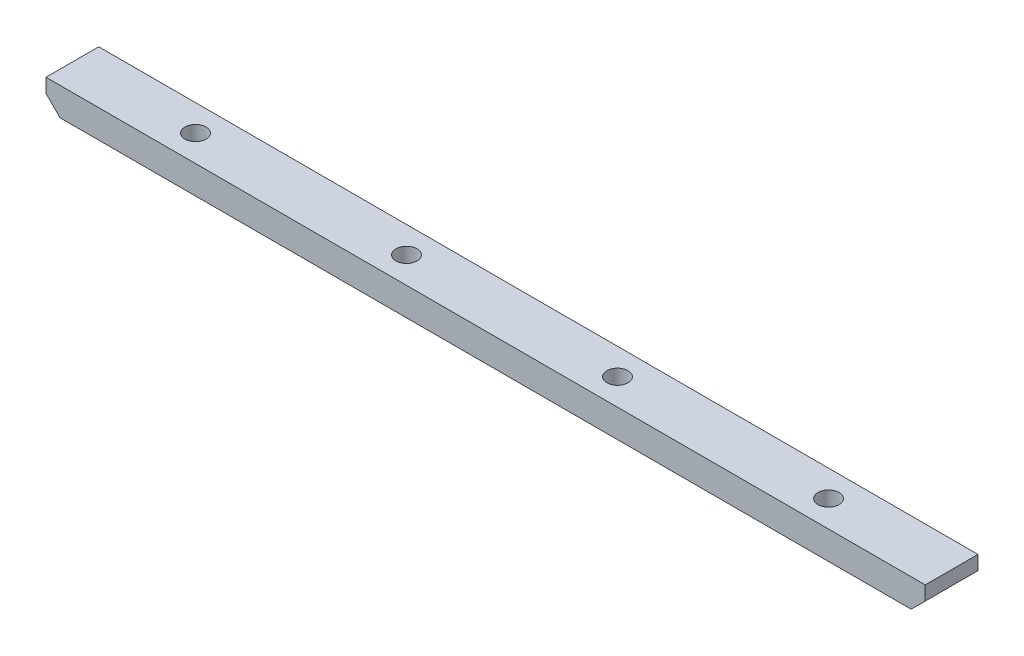
ISO-10303-21;
HEADER;
FILE_DESCRIPTION(('STEP AP214'),'2;1');
FILE_NAME('part.step','',(''),(''),'','','');
FILE_SCHEMA(('AUTOMOTIVE_DESIGN { 1 0 10303 214 1 1 1 1 }'));
ENDSEC;
DATA;
#1=APPLICATION_CONTEXT('core data for automotive mechanical design processes');
#2=APPLICATION_PROTOCOL_DEFINITION('international standard','automotive_design',2000,#1);
#3=PRODUCT_CONTEXT('',#1,'mechanical');
#4=PRODUCT('Part','Part','',(#3));
#5=PRODUCT_RELATED_PRODUCT_CATEGORY('part','',(#4));
#6=PRODUCT_DEFINITION_FORMATION('','',#4);
#7=PRODUCT_DEFINITION_CONTEXT('part definition',#1,'design');
#8=PRODUCT_DEFINITION('design','',#6,#7);
#9=PRODUCT_DEFINITION_SHAPE('','',#8);
#10=(LENGTH_UNIT() NAMED_UNIT(*) SI_UNIT(.MILLI.,.METRE.));
#11=(NAMED_UNIT(*) PLANE_ANGLE_UNIT() SI_UNIT($,.RADIAN.));
#12=(NAMED_UNIT(*) SI_UNIT($,.STERADIAN.) SOLID_ANGLE_UNIT());
#13=UNCERTAINTY_MEASURE_WITH_UNIT(LENGTH_MEASURE(1.E-05),#10,'distance_accuracy_value','');
#14=(GEOMETRIC_REPRESENTATION_CONTEXT(3) GLOBAL_UNCERTAINTY_ASSIGNED_CONTEXT((#13)) GLOBAL_UNIT_ASSIGNED_CONTEXT((#10,
#11,#12)) REPRESENTATION_CONTEXT('',''));
#15=CARTESIAN_POINT('',(0.,0.,0.));
#16=DIRECTION('',(0.,0.,1.));
#17=DIRECTION('',(1.,0.,0.));
#18=AXIS2_PLACEMENT_3D('',#15,#16,#17);
#19=CARTESIAN_POINT('',(125.,4.,-15.));
#20=DIRECTION('',(1.,0.,0.));
#21=DIRECTION('',(0.,0.,-1.));
#22=AXIS2_PLACEMENT_3D('',#19,#20,#21);
#23=PLANE('',#22);
#24=DIRECTION('',(0.,1.,0.));
#25=VECTOR('',#24,1.);
#26=CARTESIAN_POINT('',(125.,4.,0.));
#27=LINE('',#26,#25);
#28=CARTESIAN_POINT('',(125.,0.,0.));
#29=VERTEX_POINT('',#28);
#30=CARTESIAN_POINT('',(125.,4.,0.));
#31=VERTEX_POINT('',#30);
#32=EDGE_CURVE('E116',#29,#31,#27,.T.);
#33=ORIENTED_EDGE('',*,*,#32,.F.);
#34=DIRECTION('',(0.,0.,-1.));
#35=VECTOR('',#34,1.);
#36=CARTESIAN_POINT('',(125.,0.,-15.));
#37=LINE('',#36,#35);
#38=CARTESIAN_POINT('',(125.,0.,-15.));
#39=VERTEX_POINT('',#38);
#40=EDGE_CURVE('E60',#29,#39,#37,.T.);
#41=ORIENTED_EDGE('',*,*,#40,.T.);
#42=DIRECTION('',(0.,1.,0.));
#43=VECTOR('',#42,1.);
#44=CARTESIAN_POINT('',(125.,4.,-15.));
#45=LINE('',#44,#43);
#46=CARTESIAN_POINT('',(125.,4.,-15.));
#47=VERTEX_POINT('',#46);
#48=EDGE_CURVE('E91',#39,#47,#45,.T.);
#49=ORIENTED_EDGE('',*,*,#48,.T.);
#50=DIRECTION('',(0.,0.,1.));
#51=VECTOR('',#50,1.);
#52=CARTESIAN_POINT('',(125.,4.,-15.));
#53=LINE('',#52,#51);
#54=EDGE_CURVE('E93',#47,#31,#53,.T.);
#55=ORIENTED_EDGE('',*,*,#54,.T.);
#56=EDGE_LOOP('',(#33,#41,#49,#55));
#57=FACE_BOUND('',#56,.T.);
#58=ADVANCED_FACE('F37',(#57),#23,.T.);
#59=CARTESIAN_POINT('',(-125.,-4.,-15.));
#60=DIRECTION('',(0.,-1.,0.));
#61=DIRECTION('',(0.,0.,-1.));
#62=AXIS2_PLACEMENT_3D('',#59,#60,#61);
#63=PLANE('',#62);
#64=CARTESIAN_POINT('',(-90.,-4.,-7.50000000000002));
#65=DIRECTION('',(0.,1.,0.));
#66=DIRECTION('',(0.,0.,1.));
#67=AXIS2_PLACEMENT_3D('',#64,#65,#66);
#68=CIRCLE('',#67,3.);
#69=CARTESIAN_POINT('',(-90.,-4.,-4.50000000000001));
#70=VERTEX_POINT('',#69);
#71=EDGE_CURVE('E277',#70,#70,#68,.T.);
#72=ORIENTED_EDGE('',*,*,#71,.T.);
#73=EDGE_LOOP('',(#72));
#74=FACE_BOUND('',#73,.T.);
#75=CARTESIAN_POINT('',(90.,-4.,-7.50000000000001));
#76=DIRECTION('',(0.,1.,0.));
#77=DIRECTION('',(0.,0.,1.));
#78=AXIS2_PLACEMENT_3D('',#75,#76,#77);
#79=CIRCLE('',#78,3.);
#80=CARTESIAN_POINT('',(90.,-4.,-4.5));
#81=VERTEX_POINT('',#80);
#82=EDGE_CURVE('E271',#81,#81,#79,.T.);
#83=ORIENTED_EDGE('',*,*,#82,.T.);
#84=EDGE_LOOP('',(#83));
#85=FACE_BOUND('',#84,.T.);
#86=CARTESIAN_POINT('',(-30.,-4.,-7.50000000000001));
#87=DIRECTION('',(0.,1.,0.));
#88=DIRECTION('',(0.,0.,1.));
#89=AXIS2_PLACEMENT_3D('',#86,#87,#88);
#90=CIRCLE('',#89,3.);
#91=CARTESIAN_POINT('',(-30.,-4.,-4.50000000000001));
#92=VERTEX_POINT('',#91);
#93=EDGE_CURVE('E263',#92,#92,#90,.T.);
#94=ORIENTED_EDGE('',*,*,#93,.T.);
#95=EDGE_LOOP('',(#94));
#96=FACE_BOUND('',#95,.T.);
#97=CARTESIAN_POINT('',(30.,-4.,-7.50000000000001));
#98=DIRECTION('',(0.,1.,0.));
#99=DIRECTION('',(0.,0.,1.));
#100=AXIS2_PLACEMENT_3D('',#97,#98,#99);
#101=CIRCLE('',#100,3.);
#102=CARTESIAN_POINT('',(30.,-4.,-4.50000000000001));
#103=VERTEX_POINT('',#102);
#104=EDGE_CURVE('E118',#103,#103,#101,.T.);
#105=ORIENTED_EDGE('',*,*,#104,.T.);
#106=EDGE_LOOP('',(#105));
#107=FACE_BOUND('',#106,.T.);
#108=DIRECTION('',(1.,0.,0.));
#109=VECTOR('',#108,1.);
#110=CARTESIAN_POINT('',(-125.,-4.,-15.));
#111=LINE('',#110,#109);
#112=CARTESIAN_POINT('',(-121.,-4.,-15.));
#113=VERTEX_POINT('',#112);
#114=CARTESIAN_POINT('',(121.,-4.,-15.));
#115=VERTEX_POINT('',#114);
#116=EDGE_CURVE('E106',#113,#115,#111,.T.);
#117=ORIENTED_EDGE('',*,*,#116,.T.);
#118=DIRECTION('',(0.,0.,1.));
#119=VECTOR('',#118,1.);
#120=CARTESIAN_POINT('',(121.,-4.,-15.));
#121=LINE('',#120,#119);
#122=CARTESIAN_POINT('',(121.,-4.,0.));
#123=VERTEX_POINT('',#122);
#124=EDGE_CURVE('E128',#115,#123,#121,.T.);
#125=ORIENTED_EDGE('',*,*,#124,.T.);
#126=DIRECTION('',(1.,0.,0.));
#127=VECTOR('',#126,1.);
#128=CARTESIAN_POINT('',(-125.,-4.,0.));
#129=LINE('',#128,#127);
#130=CARTESIAN_POINT('',(-121.,-4.,0.));
#131=VERTEX_POINT('',#130);
#132=EDGE_CURVE('E98',#131,#123,#129,.T.);
#133=ORIENTED_EDGE('',*,*,#132,.F.);
#134=DIRECTION('',(0.,0.,-1.));
#135=VECTOR('',#134,1.);
#136=CARTESIAN_POINT('',(-121.,-4.,-15.));
#137=LINE('',#136,#135);
#138=EDGE_CURVE('E125',#131,#113,#137,.T.);
#139=ORIENTED_EDGE('',*,*,#138,.T.);
#140=EDGE_LOOP('',(#117,#125,#133,#139));
#141=FACE_BOUND('',#140,.T.);
#142=ADVANCED_FACE('F139',(#74,#85,#96,#107,#141),#63,.T.);
#143=CARTESIAN_POINT('',(-125.,4.,-15.));
#144=DIRECTION('',(-1.,0.,0.));
#145=DIRECTION('',(0.,0.,1.));
#146=AXIS2_PLACEMENT_3D('',#143,#144,#145);
#147=PLANE('',#146);
#148=DIRECTION('',(0.,-1.,0.));
#149=VECTOR('',#148,1.);
#150=CARTESIAN_POINT('',(-125.,4.,-15.));
#151=LINE('',#150,#149);
#152=CARTESIAN_POINT('',(-125.,4.,-15.));
#153=VERTEX_POINT('',#152);
#154=CARTESIAN_POINT('',(-125.,0.,-15.));
#155=VERTEX_POINT('',#154);
#156=EDGE_CURVE('E109',#153,#155,#151,.T.);
#157=ORIENTED_EDGE('',*,*,#156,.T.);
#158=DIRECTION('',(0.,0.,1.));
#159=VECTOR('',#158,1.);
#160=CARTESIAN_POINT('',(-125.,0.,-15.));
#161=LINE('',#160,#159);
#162=CARTESIAN_POINT('',(-125.,0.,0.));
#163=VERTEX_POINT('',#162);
#164=EDGE_CURVE('E11',#155,#163,#161,.T.);
#165=ORIENTED_EDGE('',*,*,#164,.T.);
#166=DIRECTION('',(0.,-1.,0.));
#167=VECTOR('',#166,1.);
#168=CARTESIAN_POINT('',(-125.,4.,0.));
#169=LINE('',#168,#167);
#170=CARTESIAN_POINT('',(-125.,4.,0.));
#171=VERTEX_POINT('',#170);
#172=EDGE_CURVE('E120',#171,#163,#169,.T.);
#173=ORIENTED_EDGE('',*,*,#172,.F.);
#174=DIRECTION('',(0.,0.,1.));
#175=VECTOR('',#174,1.);
#176=CARTESIAN_POINT('',(-125.,4.,-15.));
#177=LINE('',#176,#175);
#178=EDGE_CURVE('E105',#153,#171,#177,.T.);
#179=ORIENTED_EDGE('',*,*,#178,.F.);
#180=EDGE_LOOP('',(#157,#165,#173,#179));
#181=FACE_BOUND('',#180,.T.);
#182=ADVANCED_FACE('F149',(#181),#147,.T.);
#183=CARTESIAN_POINT('',(-125.,4.,-15.));
#184=DIRECTION('',(0.,1.,0.));
#185=DIRECTION('',(0.,0.,1.));
#186=AXIS2_PLACEMENT_3D('',#183,#184,#185);
#187=PLANE('',#186);
#188=CARTESIAN_POINT('',(-90.,4.,-7.50000000000002));
#189=DIRECTION('',(0.,1.,0.));
#190=DIRECTION('',(0.,0.,1.));
#191=AXIS2_PLACEMENT_3D('',#188,#189,#190);
#192=CIRCLE('',#191,3.);
#193=CARTESIAN_POINT('',(-90.,4.,-4.50000000000001));
#194=VERTEX_POINT('',#193);
#195=EDGE_CURVE('E280',#194,#194,#192,.T.);
#196=ORIENTED_EDGE('',*,*,#195,.F.);
#197=EDGE_LOOP('',(#196));
#198=FACE_BOUND('',#197,.T.);
#199=CARTESIAN_POINT('',(90.,4.,-7.50000000000001));
#200=DIRECTION('',(0.,1.,0.));
#201=DIRECTION('',(0.,0.,1.));
#202=AXIS2_PLACEMENT_3D('',#199,#200,#201);
#203=CIRCLE('',#202,3.);
#204=CARTESIAN_POINT('',(90.,4.,-4.5));
#205=VERTEX_POINT('',#204);
#206=EDGE_CURVE('E274',#205,#205,#203,.T.);
#207=ORIENTED_EDGE('',*,*,#206,.F.);
#208=EDGE_LOOP('',(#207));
#209=FACE_BOUND('',#208,.T.);
#210=CARTESIAN_POINT('',(-30.,4.,-7.50000000000001));
#211=DIRECTION('',(0.,1.,0.));
#212=DIRECTION('',(0.,0.,1.));
#213=AXIS2_PLACEMENT_3D('',#210,#211,#212);
#214=CIRCLE('',#213,3.);
#215=CARTESIAN_POINT('',(-30.,4.,-4.50000000000001));
#216=VERTEX_POINT('',#215);
#217=EDGE_CURVE('E266',#216,#216,#214,.T.);
#218=ORIENTED_EDGE('',*,*,#217,.F.);
#219=EDGE_LOOP('',(#218));
#220=FACE_BOUND('',#219,.T.);
#221=CARTESIAN_POINT('',(30.,4.,-7.50000000000001));
#222=DIRECTION('',(0.,1.,0.));
#223=DIRECTION('',(0.,0.,1.));
#224=AXIS2_PLACEMENT_3D('',#221,#222,#223);
#225=CIRCLE('',#224,3.);
#226=CARTESIAN_POINT('',(30.,4.,-4.50000000000001));
#227=VERTEX_POINT('',#226);
#228=EDGE_CURVE('E261',#227,#227,#225,.T.);
#229=ORIENTED_EDGE('',*,*,#228,.F.);
#230=EDGE_LOOP('',(#229));
#231=FACE_BOUND('',#230,.T.);
#232=DIRECTION('',(-1.,0.,0.));
#233=VECTOR('',#232,1.);
#234=CARTESIAN_POINT('',(-125.,4.,0.));
#235=LINE('',#234,#233);
#236=EDGE_CURVE('E104',#31,#171,#235,.T.);
#237=ORIENTED_EDGE('',*,*,#236,.F.);
#238=ORIENTED_EDGE('',*,*,#54,.F.);
#239=DIRECTION('',(-1.,0.,0.));
#240=VECTOR('',#239,1.);
#241=CARTESIAN_POINT('',(-125.,4.,-15.));
#242=LINE('',#241,#240);
#243=EDGE_CURVE('E97',#47,#153,#242,.T.);
#244=ORIENTED_EDGE('',*,*,#243,.T.);
#245=ORIENTED_EDGE('',*,*,#178,.T.);
#246=EDGE_LOOP('',(#237,#238,#244,#245));
#247=FACE_BOUND('',#246,.T.);
#248=ADVANCED_FACE('F102',(#198,#209,#220,#231,#247),#187,.T.);
#249=CARTESIAN_POINT('',(0.,0.,-15.));
#250=DIRECTION('',(0.,0.,1.));
#251=DIRECTION('',(1.,0.,0.));
#252=AXIS2_PLACEMENT_3D('',#249,#250,#251);
#253=PLANE('',#252);
#254=ORIENTED_EDGE('',*,*,#48,.F.);
#255=DIRECTION('',(0.707106781186545,0.70710678118655,0.));
#256=VECTOR('',#255,1.);
#257=CARTESIAN_POINT('',(121.,-4.,-15.));
#258=LINE('',#257,#256);
#259=EDGE_CURVE('E45',#39,#115,#258,.F.);
#260=ORIENTED_EDGE('',*,*,#259,.T.);
#261=ORIENTED_EDGE('',*,*,#116,.F.);
#262=DIRECTION('',(0.70710678118655,-0.707106781186545,0.));
#263=VECTOR('',#262,1.);
#264=CARTESIAN_POINT('',(-125.,0.,-15.));
#265=LINE('',#264,#263);
#266=EDGE_CURVE('E52',#113,#155,#265,.F.);
#267=ORIENTED_EDGE('',*,*,#266,.T.);
#268=ORIENTED_EDGE('',*,*,#156,.F.);
#269=ORIENTED_EDGE('',*,*,#243,.F.);
#270=EDGE_LOOP('',(#254,#260,#261,#267,#268,#269));
#271=FACE_BOUND('',#270,.T.);
#272=ADVANCED_FACE('F108',(#271),#253,.F.);
#273=CARTESIAN_POINT('',(0.,0.,0.));
#274=DIRECTION('',(0.,0.,1.));
#275=DIRECTION('',(1.,0.,0.));
#276=AXIS2_PLACEMENT_3D('',#273,#274,#275);
#277=PLANE('',#276);
#278=ORIENTED_EDGE('',*,*,#132,.T.);
#279=DIRECTION('',(-0.707106781186545,-0.70710678118655,0.));
#280=VECTOR('',#279,1.);
#281=CARTESIAN_POINT('',(62.5000000000004,-62.5,0.));
#282=LINE('',#281,#280);
#283=EDGE_CURVE('E133',#123,#29,#282,.F.);
#284=ORIENTED_EDGE('',*,*,#283,.T.);
#285=ORIENTED_EDGE('',*,*,#32,.T.);
#286=ORIENTED_EDGE('',*,*,#236,.T.);
#287=ORIENTED_EDGE('',*,*,#172,.T.);
#288=DIRECTION('',(-0.70710678118655,0.707106781186545,0.));
#289=VECTOR('',#288,1.);
#290=CARTESIAN_POINT('',(-62.4999999999996,-62.5,0.));
#291=LINE('',#290,#289);
#292=EDGE_CURVE('E131',#163,#131,#291,.F.);
#293=ORIENTED_EDGE('',*,*,#292,.T.);
#294=EDGE_LOOP('',(#278,#284,#285,#286,#287,#293));
#295=FACE_BOUND('',#294,.T.);
#296=ADVANCED_FACE('F144',(#295),#277,.T.);
#297=CARTESIAN_POINT('',(30.,4.,-7.50000000000001));
#298=DIRECTION('',(0.,1.,0.));
#299=DIRECTION('',(0.,0.,1.));
#300=AXIS2_PLACEMENT_3D('',#297,#298,#299);
#301=CYLINDRICAL_SURFACE('',#300,3.);
#302=ORIENTED_EDGE('',*,*,#104,.F.);
#303=EDGE_LOOP('',(#302));
#304=FACE_BOUND('',#303,.T.);
#305=ORIENTED_EDGE('',*,*,#228,.T.);
#306=EDGE_LOOP('',(#305));
#307=FACE_BOUND('',#306,.T.);
#308=ADVANCED_FACE('F184',(#304,#307),#301,.F.);
#309=CARTESIAN_POINT('',(-30.,4.,-7.50000000000001));
#310=DIRECTION('',(0.,1.,0.));
#311=DIRECTION('',(0.,0.,1.));
#312=AXIS2_PLACEMENT_3D('',#309,#310,#311);
#313=CYLINDRICAL_SURFACE('',#312,3.);
#314=ORIENTED_EDGE('',*,*,#93,.F.);
#315=EDGE_LOOP('',(#314));
#316=FACE_BOUND('',#315,.T.);
#317=ORIENTED_EDGE('',*,*,#217,.T.);
#318=EDGE_LOOP('',(#317));
#319=FACE_BOUND('',#318,.T.);
#320=ADVANCED_FACE('F176',(#316,#319),#313,.F.);
#321=CARTESIAN_POINT('',(90.,4.,-7.50000000000001));
#322=DIRECTION('',(0.,1.,0.));
#323=DIRECTION('',(0.,0.,1.));
#324=AXIS2_PLACEMENT_3D('',#321,#322,#323);
#325=CYLINDRICAL_SURFACE('',#324,3.);
#326=ORIENTED_EDGE('',*,*,#82,.F.);
#327=EDGE_LOOP('',(#326));
#328=FACE_BOUND('',#327,.T.);
#329=ORIENTED_EDGE('',*,*,#206,.T.);
#330=EDGE_LOOP('',(#329));
#331=FACE_BOUND('',#330,.T.);
#332=ADVANCED_FACE('F170',(#328,#331),#325,.F.);
#333=CARTESIAN_POINT('',(-90.,4.,-7.50000000000002));
#334=DIRECTION('',(0.,1.,0.));
#335=DIRECTION('',(0.,0.,1.));
#336=AXIS2_PLACEMENT_3D('',#333,#334,#335);
#337=CYLINDRICAL_SURFACE('',#336,3.);
#338=ORIENTED_EDGE('',*,*,#71,.F.);
#339=EDGE_LOOP('',(#338));
#340=FACE_BOUND('',#339,.T.);
#341=ORIENTED_EDGE('',*,*,#195,.T.);
#342=EDGE_LOOP('',(#341));
#343=FACE_BOUND('',#342,.T.);
#344=ADVANCED_FACE('F165',(#340,#343),#337,.F.);
#345=CARTESIAN_POINT('',(121.,-4.,-15.));
#346=DIRECTION('',(-0.70710678118655,0.707106781186545,0.));
#347=DIRECTION('',(0.,0.,1.));
#348=AXIS2_PLACEMENT_3D('',#345,#346,#347);
#349=PLANE('',#348);
#350=ORIENTED_EDGE('',*,*,#259,.F.);
#351=ORIENTED_EDGE('',*,*,#40,.F.);
#352=ORIENTED_EDGE('',*,*,#283,.F.);
#353=ORIENTED_EDGE('',*,*,#124,.F.);
#354=EDGE_LOOP('',(#350,#351,#352,#353));
#355=FACE_BOUND('',#354,.T.);
#356=ADVANCED_FACE('F142',(#355),#349,.F.);
#357=CARTESIAN_POINT('',(-125.,0.,-15.));
#358=DIRECTION('',(0.707106781186545,0.70710678118655,0.));
#359=DIRECTION('',(0.,0.,1.));
#360=AXIS2_PLACEMENT_3D('',#357,#358,#359);
#361=PLANE('',#360);
#362=ORIENTED_EDGE('',*,*,#266,.F.);
#363=ORIENTED_EDGE('',*,*,#138,.F.);
#364=ORIENTED_EDGE('',*,*,#292,.F.);
#365=ORIENTED_EDGE('',*,*,#164,.F.);
#366=EDGE_LOOP('',(#362,#363,#364,#365));
#367=FACE_BOUND('',#366,.T.);
#368=ADVANCED_FACE('F39',(#367),#361,.F.);
#369=CLOSED_SHELL('',(#58,#142,#182,#248,#272,#296,#308,#320,#332,#344,#356,#368));
#370=MANIFOLD_SOLID_BREP('B2',#369);
#371=ADVANCED_BREP_SHAPE_REPRESENTATION('',(#18,#370),#14);
#372=SHAPE_DEFINITION_REPRESENTATION(#9,#371);
ENDSEC;
END-ISO-10303-21;
